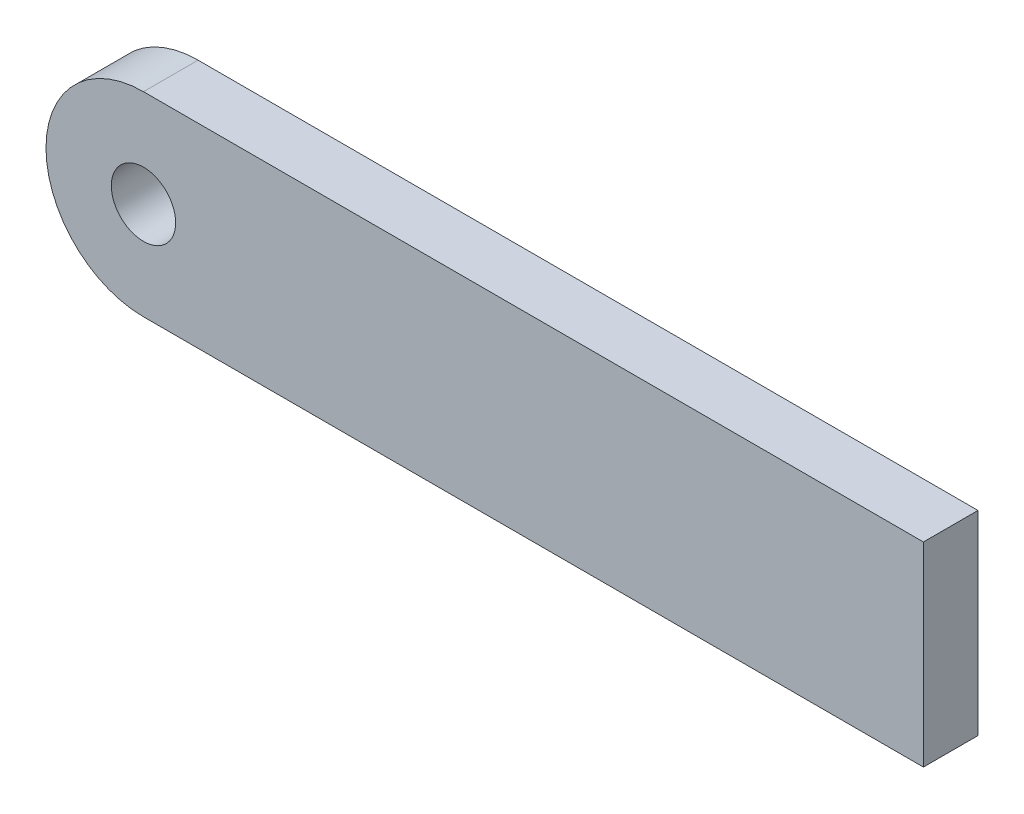
ISO-10303-21;
HEADER;
FILE_DESCRIPTION(('STEP AP214'),'2;1');
FILE_NAME('part.step','',(''),(''),'','','');
FILE_SCHEMA(('AUTOMOTIVE_DESIGN { 1 0 10303 214 1 1 1 1 }'));
ENDSEC;
DATA;
#1=APPLICATION_CONTEXT('core data for automotive mechanical design processes');
#2=APPLICATION_PROTOCOL_DEFINITION('international standard','automotive_design',2000,#1);
#3=PRODUCT_CONTEXT('',#1,'mechanical');
#4=PRODUCT('Part','Part','',(#3));
#5=PRODUCT_RELATED_PRODUCT_CATEGORY('part','',(#4));
#6=PRODUCT_DEFINITION_FORMATION('','',#4);
#7=PRODUCT_DEFINITION_CONTEXT('part definition',#1,'design');
#8=PRODUCT_DEFINITION('design','',#6,#7);
#9=PRODUCT_DEFINITION_SHAPE('','',#8);
#10=(LENGTH_UNIT() NAMED_UNIT(*) SI_UNIT(.MILLI.,.METRE.));
#11=(NAMED_UNIT(*) PLANE_ANGLE_UNIT() SI_UNIT($,.RADIAN.));
#12=(NAMED_UNIT(*) SI_UNIT($,.STERADIAN.) SOLID_ANGLE_UNIT());
#13=UNCERTAINTY_MEASURE_WITH_UNIT(LENGTH_MEASURE(1.E-05),#10,'distance_accuracy_value','');
#14=(GEOMETRIC_REPRESENTATION_CONTEXT(3) GLOBAL_UNCERTAINTY_ASSIGNED_CONTEXT((#13)) GLOBAL_UNIT_ASSIGNED_CONTEXT((#10,
#11,#12)) REPRESENTATION_CONTEXT('',''));
#15=CARTESIAN_POINT('',(0.,0.,0.));
#16=DIRECTION('',(0.,0.,1.));
#17=DIRECTION('',(1.,0.,0.));
#18=AXIS2_PLACEMENT_3D('',#15,#16,#17);
#19=CARTESIAN_POINT('',(0.,0.,1.4));
#20=DIRECTION('',(0.,0.,1.));
#21=DIRECTION('',(1.,0.,0.));
#22=AXIS2_PLACEMENT_3D('',#19,#20,#21);
#23=PLANE('',#22);
#24=DIRECTION('',(0.,1.,0.));
#25=VECTOR('',#24,1.);
#26=CARTESIAN_POINT('',(40.,-5.,1.4));
#27=LINE('',#26,#25);
#28=CARTESIAN_POINT('',(40.,-5.,1.4));
#29=VERTEX_POINT('',#28);
#30=CARTESIAN_POINT('',(40.,5.,1.4));
#31=VERTEX_POINT('',#30);
#32=EDGE_CURVE('E82',#29,#31,#27,.T.);
#33=ORIENTED_EDGE('',*,*,#32,.T.);
#34=DIRECTION('',(-1.,0.,0.));
#35=VECTOR('',#34,1.);
#36=CARTESIAN_POINT('',(0.,5.,1.4));
#37=LINE('',#36,#35);
#38=CARTESIAN_POINT('',(0.,5.,1.4));
#39=VERTEX_POINT('',#38);
#40=EDGE_CURVE('E77',#31,#39,#37,.T.);
#41=ORIENTED_EDGE('',*,*,#40,.T.);
#42=CARTESIAN_POINT('',(0.,0.,1.4));
#43=DIRECTION('',(0.,0.,1.));
#44=DIRECTION('',(1.,0.,0.));
#45=AXIS2_PLACEMENT_3D('',#42,#43,#44);
#46=CIRCLE('',#45,5.);
#47=CARTESIAN_POINT('',(0.,-5.,1.4));
#48=VERTEX_POINT('',#47);
#49=EDGE_CURVE('E80',#39,#48,#46,.T.);
#50=ORIENTED_EDGE('',*,*,#49,.T.);
#51=DIRECTION('',(1.,0.,0.));
#52=VECTOR('',#51,1.);
#53=CARTESIAN_POINT('',(0.,-5.,1.4));
#54=LINE('',#53,#52);
#55=EDGE_CURVE('E47',#48,#29,#54,.T.);
#56=ORIENTED_EDGE('',*,*,#55,.T.);
#57=EDGE_LOOP('',(#33,#41,#50,#56));
#58=FACE_BOUND('',#57,.T.);
#59=CARTESIAN_POINT('',(0.,0.,1.4));
#60=DIRECTION('',(0.,0.,1.));
#61=DIRECTION('',(1.,0.,0.));
#62=AXIS2_PLACEMENT_3D('',#59,#60,#61);
#63=CIRCLE('',#62,1.65);
#64=CARTESIAN_POINT('',(1.65,0.,1.4));
#65=VERTEX_POINT('',#64);
#66=EDGE_CURVE('E97',#65,#65,#63,.T.);
#67=ORIENTED_EDGE('',*,*,#66,.F.);
#68=EDGE_LOOP('',(#67));
#69=FACE_BOUND('',#68,.T.);
#70=ADVANCED_FACE('F30',(#58,#69),#23,.T.);
#71=CARTESIAN_POINT('',(0.,0.,-1.4));
#72=DIRECTION('',(0.,0.,1.));
#73=DIRECTION('',(1.,0.,0.));
#74=AXIS2_PLACEMENT_3D('',#71,#72,#73);
#75=PLANE('',#74);
#76=DIRECTION('',(0.,1.,0.));
#77=VECTOR('',#76,1.);
#78=CARTESIAN_POINT('',(40.,-5.,-1.4));
#79=LINE('',#78,#77);
#80=CARTESIAN_POINT('',(40.,-5.,-1.4));
#81=VERTEX_POINT('',#80);
#82=CARTESIAN_POINT('',(40.,5.,-1.4));
#83=VERTEX_POINT('',#82);
#84=EDGE_CURVE('E94',#81,#83,#79,.T.);
#85=ORIENTED_EDGE('',*,*,#84,.F.);
#86=DIRECTION('',(1.,0.,0.));
#87=VECTOR('',#86,1.);
#88=CARTESIAN_POINT('',(0.,-5.,-1.4));
#89=LINE('',#88,#87);
#90=CARTESIAN_POINT('',(0.,-5.,-1.4));
#91=VERTEX_POINT('',#90);
#92=EDGE_CURVE('E70',#91,#81,#89,.T.);
#93=ORIENTED_EDGE('',*,*,#92,.F.);
#94=CARTESIAN_POINT('',(0.,0.,-1.4));
#95=DIRECTION('',(0.,0.,1.));
#96=DIRECTION('',(1.,0.,0.));
#97=AXIS2_PLACEMENT_3D('',#94,#95,#96);
#98=CIRCLE('',#97,5.);
#99=CARTESIAN_POINT('',(0.,5.,-1.4));
#100=VERTEX_POINT('',#99);
#101=EDGE_CURVE('E64',#100,#91,#98,.T.);
#102=ORIENTED_EDGE('',*,*,#101,.F.);
#103=DIRECTION('',(-1.,0.,0.));
#104=VECTOR('',#103,1.);
#105=CARTESIAN_POINT('',(0.,5.,-1.4));
#106=LINE('',#105,#104);
#107=EDGE_CURVE('E86',#83,#100,#106,.T.);
#108=ORIENTED_EDGE('',*,*,#107,.F.);
#109=EDGE_LOOP('',(#85,#93,#102,#108));
#110=FACE_BOUND('',#109,.T.);
#111=CARTESIAN_POINT('',(0.,0.,-1.4));
#112=DIRECTION('',(0.,0.,1.));
#113=DIRECTION('',(1.,0.,0.));
#114=AXIS2_PLACEMENT_3D('',#111,#112,#113);
#115=CIRCLE('',#114,1.65);
#116=CARTESIAN_POINT('',(1.65,0.,-1.4));
#117=VERTEX_POINT('',#116);
#118=EDGE_CURVE('E109',#117,#117,#115,.T.);
#119=ORIENTED_EDGE('',*,*,#118,.T.);
#120=EDGE_LOOP('',(#119));
#121=FACE_BOUND('',#120,.T.);
#122=ADVANCED_FACE('F105',(#110,#121),#75,.F.);
#123=CARTESIAN_POINT('',(40.,-5.,1.4));
#124=DIRECTION('',(-1.,0.,0.));
#125=DIRECTION('',(0.,0.,1.));
#126=AXIS2_PLACEMENT_3D('',#123,#124,#125);
#127=PLANE('',#126);
#128=ORIENTED_EDGE('',*,*,#84,.T.);
#129=DIRECTION('',(0.,0.,-1.));
#130=VECTOR('',#129,1.);
#131=CARTESIAN_POINT('',(40.,5.,1.4));
#132=LINE('',#131,#130);
#133=EDGE_CURVE('E11',#31,#83,#132,.T.);
#134=ORIENTED_EDGE('',*,*,#133,.F.);
#135=ORIENTED_EDGE('',*,*,#32,.F.);
#136=DIRECTION('',(0.,0.,-1.));
#137=VECTOR('',#136,1.);
#138=CARTESIAN_POINT('',(40.,-5.,1.4));
#139=LINE('',#138,#137);
#140=EDGE_CURVE('E90',#29,#81,#139,.T.);
#141=ORIENTED_EDGE('',*,*,#140,.T.);
#142=EDGE_LOOP('',(#128,#134,#135,#141));
#143=FACE_BOUND('',#142,.T.);
#144=ADVANCED_FACE('F32',(#143),#127,.F.);
#145=CARTESIAN_POINT('',(0.,5.,1.4));
#146=DIRECTION('',(0.,-1.,0.));
#147=DIRECTION('',(1.,0.,0.));
#148=AXIS2_PLACEMENT_3D('',#145,#146,#147);
#149=PLANE('',#148);
#150=ORIENTED_EDGE('',*,*,#107,.T.);
#151=DIRECTION('',(0.,0.,-1.));
#152=VECTOR('',#151,1.);
#153=CARTESIAN_POINT('',(0.,5.,1.4));
#154=LINE('',#153,#152);
#155=EDGE_CURVE('E39',#39,#100,#154,.T.);
#156=ORIENTED_EDGE('',*,*,#155,.F.);
#157=ORIENTED_EDGE('',*,*,#40,.F.);
#158=ORIENTED_EDGE('',*,*,#133,.T.);
#159=EDGE_LOOP('',(#150,#156,#157,#158));
#160=FACE_BOUND('',#159,.T.);
#161=ADVANCED_FACE('F85',(#160),#149,.F.);
#162=CARTESIAN_POINT('',(0.,0.,1.4));
#163=DIRECTION('',(0.,0.,-1.));
#164=DIRECTION('',(-1.,0.,0.));
#165=AXIS2_PLACEMENT_3D('',#162,#163,#164);
#166=CYLINDRICAL_SURFACE('',#165,5.);
#167=ORIENTED_EDGE('',*,*,#101,.T.);
#168=DIRECTION('',(0.,0.,-1.));
#169=VECTOR('',#168,1.);
#170=CARTESIAN_POINT('',(0.,-5.,1.4));
#171=LINE('',#170,#169);
#172=EDGE_CURVE('E87',#48,#91,#171,.T.);
#173=ORIENTED_EDGE('',*,*,#172,.F.);
#174=ORIENTED_EDGE('',*,*,#49,.F.);
#175=ORIENTED_EDGE('',*,*,#155,.T.);
#176=EDGE_LOOP('',(#167,#173,#174,#175));
#177=FACE_BOUND('',#176,.T.);
#178=ADVANCED_FACE('F88',(#177),#166,.T.);
#179=CARTESIAN_POINT('',(0.,-5.,1.4));
#180=DIRECTION('',(0.,1.,0.));
#181=DIRECTION('',(-1.,0.,0.));
#182=AXIS2_PLACEMENT_3D('',#179,#180,#181);
#183=PLANE('',#182);
#184=ORIENTED_EDGE('',*,*,#92,.T.);
#185=ORIENTED_EDGE('',*,*,#140,.F.);
#186=ORIENTED_EDGE('',*,*,#55,.F.);
#187=ORIENTED_EDGE('',*,*,#172,.T.);
#188=EDGE_LOOP('',(#184,#185,#186,#187));
#189=FACE_BOUND('',#188,.T.);
#190=ADVANCED_FACE('F102',(#189),#183,.F.);
#191=CARTESIAN_POINT('',(0.,0.,1.4));
#192=DIRECTION('',(0.,0.,-1.));
#193=DIRECTION('',(-1.,0.,0.));
#194=AXIS2_PLACEMENT_3D('',#191,#192,#193);
#195=CYLINDRICAL_SURFACE('',#194,1.65);
#196=ORIENTED_EDGE('',*,*,#66,.T.);
#197=EDGE_LOOP('',(#196));
#198=FACE_BOUND('',#197,.T.);
#199=ORIENTED_EDGE('',*,*,#118,.F.);
#200=EDGE_LOOP('',(#199));
#201=FACE_BOUND('',#200,.T.);
#202=ADVANCED_FACE('F115',(#198,#201),#195,.F.);
#203=CLOSED_SHELL('',(#70,#122,#144,#161,#178,#190,#202));
#204=MANIFOLD_SOLID_BREP('B2',#203);
#205=ADVANCED_BREP_SHAPE_REPRESENTATION('',(#18,#204),#14);
#206=SHAPE_DEFINITION_REPRESENTATION(#9,#205);
ENDSEC;
END-ISO-10303-21;
